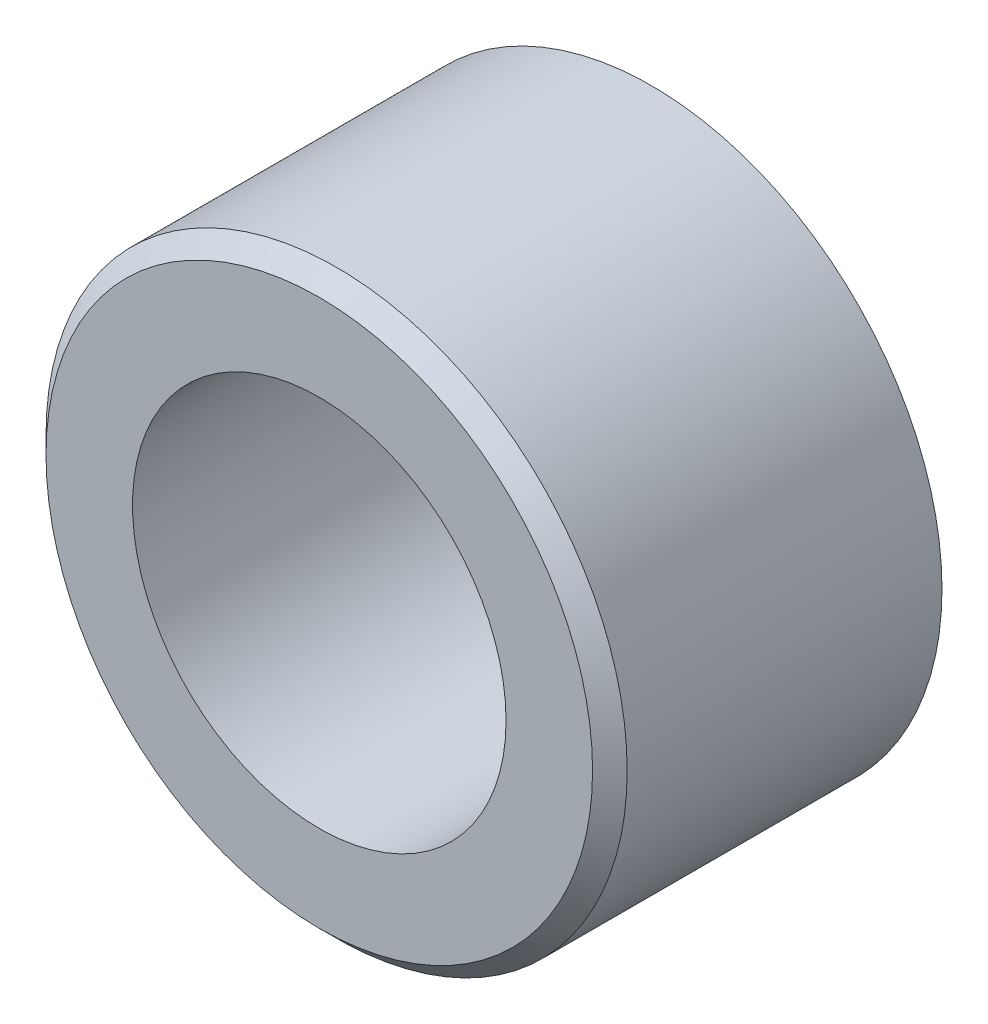
ISO-10303-21;
HEADER;
FILE_DESCRIPTION(('STEP AP214'),'2;1');
FILE_NAME('part.step','',(''),(''),'','','');
FILE_SCHEMA(('AUTOMOTIVE_DESIGN { 1 0 10303 214 1 1 1 1 }'));
ENDSEC;
DATA;
#1=APPLICATION_CONTEXT('core data for automotive mechanical design processes');
#2=APPLICATION_PROTOCOL_DEFINITION('international standard','automotive_design',2000,#1);
#3=PRODUCT_CONTEXT('',#1,'mechanical');
#4=PRODUCT('Part','Part','',(#3));
#5=PRODUCT_RELATED_PRODUCT_CATEGORY('part','',(#4));
#6=PRODUCT_DEFINITION_FORMATION('','',#4);
#7=PRODUCT_DEFINITION_CONTEXT('part definition',#1,'design');
#8=PRODUCT_DEFINITION('design','',#6,#7);
#9=PRODUCT_DEFINITION_SHAPE('','',#8);
#10=(LENGTH_UNIT() NAMED_UNIT(*) SI_UNIT(.MILLI.,.METRE.));
#11=(NAMED_UNIT(*) PLANE_ANGLE_UNIT() SI_UNIT($,.RADIAN.));
#12=(NAMED_UNIT(*) SI_UNIT($,.STERADIAN.) SOLID_ANGLE_UNIT());
#13=UNCERTAINTY_MEASURE_WITH_UNIT(LENGTH_MEASURE(1.E-05),#10,'distance_accuracy_value','');
#14=(GEOMETRIC_REPRESENTATION_CONTEXT(3) GLOBAL_UNCERTAINTY_ASSIGNED_CONTEXT((#13)) GLOBAL_UNIT_ASSIGNED_CONTEXT((#10,
#11,#12)) REPRESENTATION_CONTEXT('',''));
#15=CARTESIAN_POINT('',(0.,0.,0.));
#16=DIRECTION('',(0.,0.,1.));
#17=DIRECTION('',(1.,0.,0.));
#18=AXIS2_PLACEMENT_3D('',#15,#16,#17);
#19=CARTESIAN_POINT('',(0.,0.,3.175));
#20=DIRECTION('',(0.,0.,1.));
#21=DIRECTION('',(1.,0.,0.));
#22=AXIS2_PLACEMENT_3D('',#19,#20,#21);
#23=PLANE('',#22);
#24=CARTESIAN_POINT('',(0.,0.,3.175));
#25=DIRECTION('',(0.,0.,1.));
#26=DIRECTION('',(1.,0.,0.));
#27=AXIS2_PLACEMENT_3D('',#24,#25,#26);
#28=CIRCLE('',#27,5.225415);
#29=CARTESIAN_POINT('',(5.225415,0.,3.175));
#30=VERTEX_POINT('',#29);
#31=EDGE_CURVE('E39',#30,#30,#28,.T.);
#32=ORIENTED_EDGE('',*,*,#31,.T.);
#33=EDGE_LOOP('',(#32));
#34=FACE_BOUND('',#33,.T.);
#35=CARTESIAN_POINT('',(0.,0.,3.175));
#36=DIRECTION('',(0.,0.,1.));
#37=DIRECTION('',(1.,0.,0.));
#38=AXIS2_PLACEMENT_3D('',#35,#36,#37);
#39=CIRCLE('',#38,3.57124);
#40=CARTESIAN_POINT('',(3.57124,0.,3.175));
#41=VERTEX_POINT('',#40);
#42=EDGE_CURVE('E47',#41,#41,#39,.T.);
#43=ORIENTED_EDGE('',*,*,#42,.F.);
#44=EDGE_LOOP('',(#43));
#45=FACE_BOUND('',#44,.T.);
#46=ADVANCED_FACE('F32',(#34,#45),#23,.T.);
#47=CARTESIAN_POINT('',(0.,0.,-3.175));
#48=DIRECTION('',(0.,0.,1.));
#49=DIRECTION('',(1.,0.,0.));
#50=AXIS2_PLACEMENT_3D('',#47,#48,#49);
#51=PLANE('',#50);
#52=CARTESIAN_POINT('',(0.,0.,-3.175));
#53=DIRECTION('',(0.,0.,1.));
#54=DIRECTION('',(1.,0.,0.));
#55=AXIS2_PLACEMENT_3D('',#52,#53,#54);
#56=CIRCLE('',#55,5.55625);
#57=CARTESIAN_POINT('',(5.55625,0.,-3.175));
#58=VERTEX_POINT('',#57);
#59=EDGE_CURVE('E43',#58,#58,#56,.T.);
#60=ORIENTED_EDGE('',*,*,#59,.F.);
#61=EDGE_LOOP('',(#60));
#62=FACE_BOUND('',#61,.T.);
#63=CARTESIAN_POINT('',(0.,0.,-3.175));
#64=DIRECTION('',(0.,0.,1.));
#65=DIRECTION('',(1.,0.,0.));
#66=AXIS2_PLACEMENT_3D('',#63,#64,#65);
#67=CIRCLE('',#66,3.57124);
#68=CARTESIAN_POINT('',(3.57124,0.,-3.175));
#69=VERTEX_POINT('',#68);
#70=EDGE_CURVE('E50',#69,#69,#67,.T.);
#71=ORIENTED_EDGE('',*,*,#70,.T.);
#72=EDGE_LOOP('',(#71));
#73=FACE_BOUND('',#72,.T.);
#74=ADVANCED_FACE('F60',(#62,#73),#51,.F.);
#75=CARTESIAN_POINT('',(0.,0.,3.175));
#76=DIRECTION('',(0.,0.,-1.));
#77=DIRECTION('',(-1.,0.,0.));
#78=AXIS2_PLACEMENT_3D('',#75,#76,#77);
#79=CYLINDRICAL_SURFACE('',#78,5.55625);
#80=CARTESIAN_POINT('',(0.,0.,2.844165));
#81=DIRECTION('',(0.,0.,1.));
#82=DIRECTION('',(1.,0.,0.));
#83=AXIS2_PLACEMENT_3D('',#80,#81,#82);
#84=CIRCLE('',#83,5.55625);
#85=CARTESIAN_POINT('',(5.55625,0.,2.844165));
#86=VERTEX_POINT('',#85);
#87=EDGE_CURVE('E10',#86,#86,#84,.F.);
#88=ORIENTED_EDGE('',*,*,#87,.T.);
#89=EDGE_LOOP('',(#88));
#90=FACE_BOUND('',#89,.T.);
#91=ORIENTED_EDGE('',*,*,#59,.T.);
#92=EDGE_LOOP('',(#91));
#93=FACE_BOUND('',#92,.T.);
#94=ADVANCED_FACE('F65',(#90,#93),#79,.T.);
#95=CARTESIAN_POINT('',(0.,0.,3.175));
#96=DIRECTION('',(0.,0.,-1.));
#97=DIRECTION('',(-1.,0.,0.));
#98=AXIS2_PLACEMENT_3D('',#95,#96,#97);
#99=CYLINDRICAL_SURFACE('',#98,3.57124);
#100=ORIENTED_EDGE('',*,*,#42,.T.);
#101=EDGE_LOOP('',(#100));
#102=FACE_BOUND('',#101,.T.);
#103=ORIENTED_EDGE('',*,*,#70,.F.);
#104=EDGE_LOOP('',(#103));
#105=FACE_BOUND('',#104,.T.);
#106=ADVANCED_FACE('F56',(#102,#105),#99,.F.);
#107=CARTESIAN_POINT('',(0.,0.,3.175));
#108=DIRECTION('',(0.,0.,-1.));
#109=DIRECTION('',(-1.,0.,0.));
#110=AXIS2_PLACEMENT_3D('',#107,#108,#109);
#111=CONICAL_SURFACE('',#110,5.225415,0.785398163397448);
#112=ORIENTED_EDGE('',*,*,#87,.F.);
#113=EDGE_LOOP('',(#112));
#114=FACE_BOUND('',#113,.T.);
#115=ORIENTED_EDGE('',*,*,#31,.F.);
#116=EDGE_LOOP('',(#115));
#117=FACE_BOUND('',#116,.T.);
#118=ADVANCED_FACE('F34',(#114,#117),#111,.T.);
#119=CLOSED_SHELL('',(#46,#74,#94,#106,#118));
#120=MANIFOLD_SOLID_BREP('B2',#119);
#121=ADVANCED_BREP_SHAPE_REPRESENTATION('',(#18,#120),#14);
#122=SHAPE_DEFINITION_REPRESENTATION(#9,#121);
ENDSEC;
END-ISO-10303-21;
